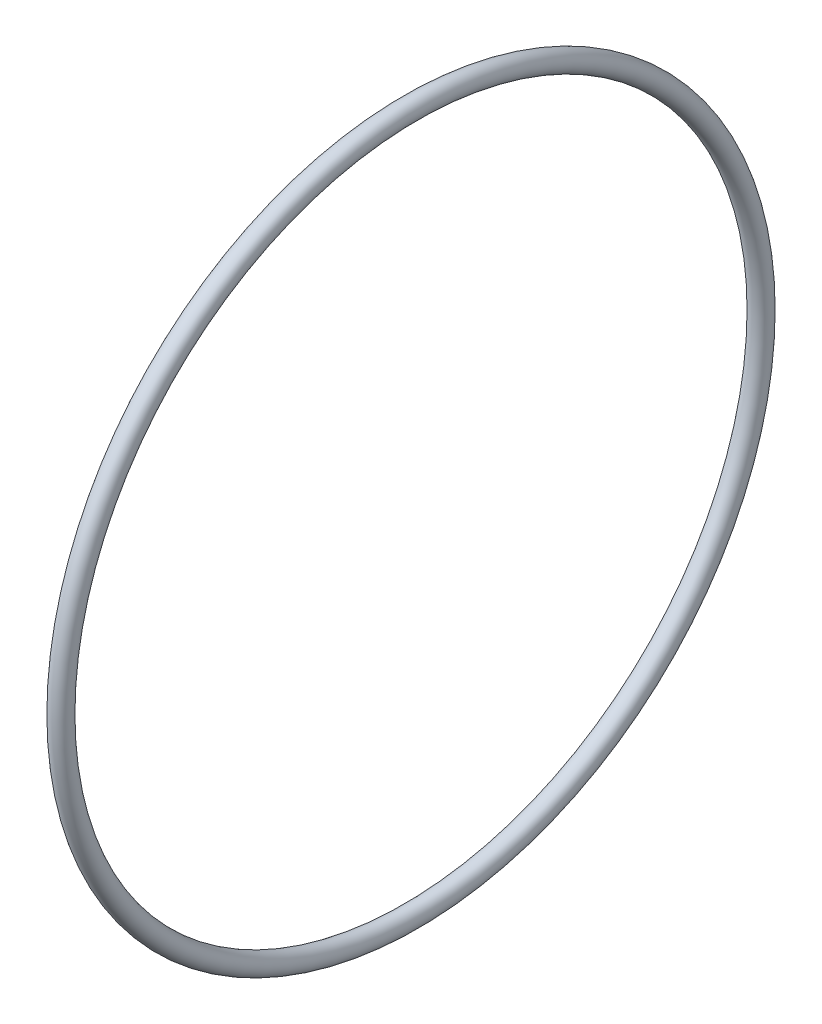
ISO-10303-21;
HEADER;
FILE_DESCRIPTION(('STEP AP214'),'2;1');
FILE_NAME('part.step','',(''),(''),'','','');
FILE_SCHEMA(('AUTOMOTIVE_DESIGN { 1 0 10303 214 1 1 1 1 }'));
ENDSEC;
DATA;
#1=APPLICATION_CONTEXT('core data for automotive mechanical design processes');
#2=APPLICATION_PROTOCOL_DEFINITION('international standard','automotive_design',2000,#1);
#3=PRODUCT_CONTEXT('',#1,'mechanical');
#4=PRODUCT('Part','Part','',(#3));
#5=PRODUCT_RELATED_PRODUCT_CATEGORY('part','',(#4));
#6=PRODUCT_DEFINITION_FORMATION('','',#4);
#7=PRODUCT_DEFINITION_CONTEXT('part definition',#1,'design');
#8=PRODUCT_DEFINITION('design','',#6,#7);
#9=PRODUCT_DEFINITION_SHAPE('','',#8);
#10=(LENGTH_UNIT() NAMED_UNIT(*) SI_UNIT(.MILLI.,.METRE.));
#11=(NAMED_UNIT(*) PLANE_ANGLE_UNIT() SI_UNIT($,.RADIAN.));
#12=(NAMED_UNIT(*) SI_UNIT($,.STERADIAN.) SOLID_ANGLE_UNIT());
#13=UNCERTAINTY_MEASURE_WITH_UNIT(LENGTH_MEASURE(1.E-05),#10,'distance_accuracy_value','');
#14=(GEOMETRIC_REPRESENTATION_CONTEXT(3) GLOBAL_UNCERTAINTY_ASSIGNED_CONTEXT((#13)) GLOBAL_UNIT_ASSIGNED_CONTEXT((#10,
#11,#12)) REPRESENTATION_CONTEXT('',''));
#15=CARTESIAN_POINT('',(0.,0.,0.));
#16=DIRECTION('',(0.,0.,1.));
#17=DIRECTION('',(1.,0.,0.));
#18=AXIS2_PLACEMENT_3D('',#15,#16,#17);
#19=CARTESIAN_POINT('',(0.,0.,0.));
#20=DIRECTION('',(1.,0.,0.));
#21=DIRECTION('',(0.,0.,-1.));
#22=AXIS2_PLACEMENT_3D('',#19,#20,#21);
#23=TOROIDAL_SURFACE('',#22,26.398,0.749);
#24=CARTESIAN_POINT('',(0.,0.,-27.147));
#25=VERTEX_POINT('',#24);
#26=VERTEX_LOOP('',#25);
#27=FACE_BOUND('',#26,.T.);
#28=ADVANCED_FACE('F13',(#27),#23,.T.);
#29=CLOSED_SHELL('',(#28));
#30=MANIFOLD_SOLID_BREP('B1',#29);
#31=ADVANCED_BREP_SHAPE_REPRESENTATION('',(#18,#30),#14);
#32=SHAPE_DEFINITION_REPRESENTATION(#9,#31);
ENDSEC;
END-ISO-10303-21;
